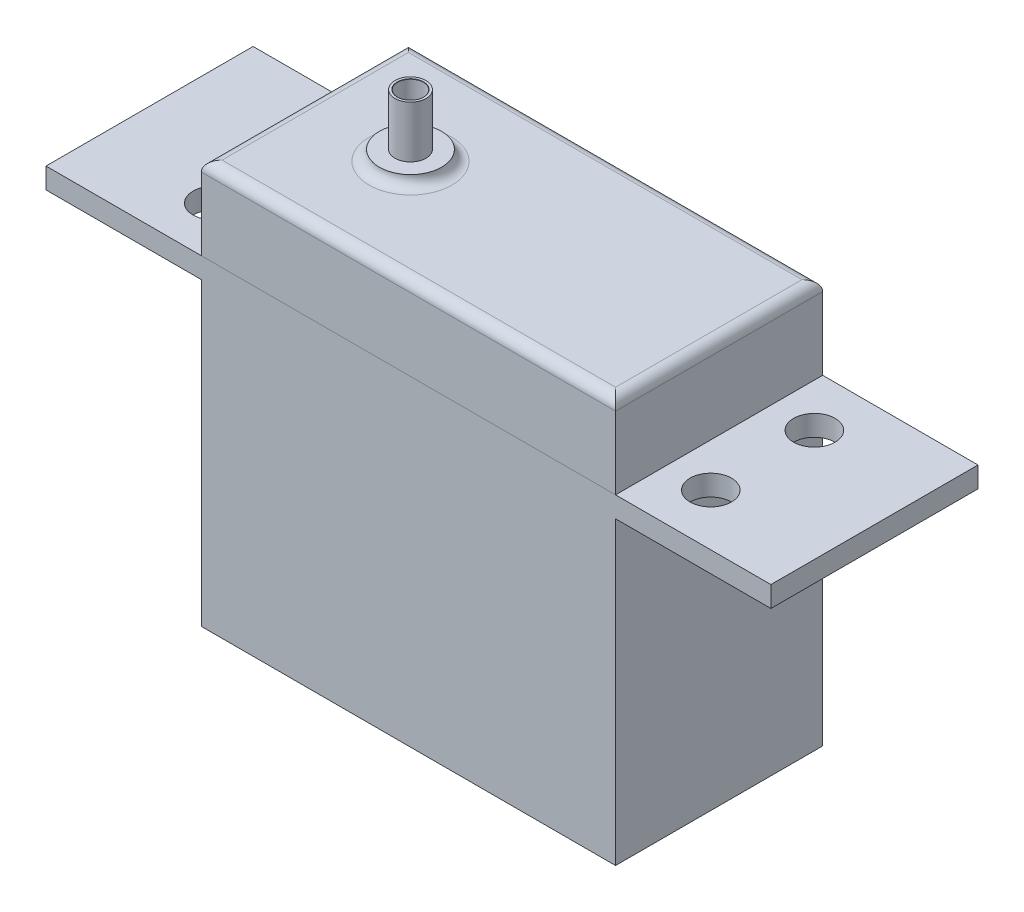
ISO-10303-21;
HEADER;
FILE_DESCRIPTION(('STEP AP214'),'2;1');
FILE_NAME('part.step','',(''),(''),'','','');
FILE_SCHEMA(('AUTOMOTIVE_DESIGN { 1 0 10303 214 1 1 1 1 }'));
ENDSEC;
DATA;
#1=APPLICATION_CONTEXT('core data for automotive mechanical design processes');
#2=APPLICATION_PROTOCOL_DEFINITION('international standard','automotive_design',2000,#1);
#3=PRODUCT_CONTEXT('',#1,'mechanical');
#4=PRODUCT('Part','Part','',(#3));
#5=PRODUCT_RELATED_PRODUCT_CATEGORY('part','',(#4));
#6=PRODUCT_DEFINITION_FORMATION('','',#4);
#7=PRODUCT_DEFINITION_CONTEXT('part definition',#1,'design');
#8=PRODUCT_DEFINITION('design','',#6,#7);
#9=PRODUCT_DEFINITION_SHAPE('','',#8);
#10=(LENGTH_UNIT() NAMED_UNIT(*) SI_UNIT(.MILLI.,.METRE.));
#11=(NAMED_UNIT(*) PLANE_ANGLE_UNIT() SI_UNIT($,.RADIAN.));
#12=(NAMED_UNIT(*) SI_UNIT($,.STERADIAN.) SOLID_ANGLE_UNIT());
#13=UNCERTAINTY_MEASURE_WITH_UNIT(LENGTH_MEASURE(1.E-05),#10,'distance_accuracy_value','');
#14=(GEOMETRIC_REPRESENTATION_CONTEXT(3) GLOBAL_UNCERTAINTY_ASSIGNED_CONTEXT((#13)) GLOBAL_UNIT_ASSIGNED_CONTEXT((#10,
#11,#12)) REPRESENTATION_CONTEXT('',''));
#15=CARTESIAN_POINT('',(0.,0.,0.));
#16=DIRECTION('',(0.,0.,1.));
#17=DIRECTION('',(1.,0.,0.));
#18=AXIS2_PLACEMENT_3D('',#15,#16,#17);
#19=CARTESIAN_POINT('',(0.,0.,0.));
#20=DIRECTION('',(0.,0.,1.));
#21=DIRECTION('',(1.,0.,0.));
#22=AXIS2_PLACEMENT_3D('',#19,#20,#21);
#23=PLANE('',#22);
#24=DIRECTION('',(-1.,0.,0.));
#25=VECTOR('',#24,1.);
#26=CARTESIAN_POINT('',(0.,11.5,0.));
#27=LINE('',#26,#25);
#28=CARTESIAN_POINT('',(20.,11.5,0.));
#29=VERTEX_POINT('',#28);
#30=CARTESIAN_POINT('',(-20.,11.5,0.));
#31=VERTEX_POINT('',#30);
#32=EDGE_CURVE('E175',#29,#31,#27,.T.);
#33=ORIENTED_EDGE('',*,*,#32,.F.);
#34=DIRECTION('',(-1.,0.,0.));
#35=VECTOR('',#34,1.);
#36=CARTESIAN_POINT('',(35.,11.5,0.));
#37=LINE('',#36,#35);
#38=CARTESIAN_POINT('',(35.,11.5,0.));
#39=VERTEX_POINT('',#38);
#40=EDGE_CURVE('E222',#39,#29,#37,.T.);
#41=ORIENTED_EDGE('',*,*,#40,.F.);
#42=DIRECTION('',(0.,-1.,0.));
#43=VECTOR('',#42,1.);
#44=CARTESIAN_POINT('',(35.,11.5,0.));
#45=LINE('',#44,#43);
#46=CARTESIAN_POINT('',(35.,9.49999999999999,0.));
#47=VERTEX_POINT('',#46);
#48=EDGE_CURVE('E209',#39,#47,#45,.T.);
#49=ORIENTED_EDGE('',*,*,#48,.T.);
#50=DIRECTION('',(-1.,0.,0.));
#51=VECTOR('',#50,1.);
#52=CARTESIAN_POINT('',(35.,9.49999999999999,0.));
#53=LINE('',#52,#51);
#54=CARTESIAN_POINT('',(20.,9.5,0.));
#55=VERTEX_POINT('',#54);
#56=EDGE_CURVE('E225',#47,#55,#53,.T.);
#57=ORIENTED_EDGE('',*,*,#56,.T.);
#58=DIRECTION('',(0.,1.,0.));
#59=VECTOR('',#58,1.);
#60=CARTESIAN_POINT('',(20.,-19.5,0.));
#61=LINE('',#60,#59);
#62=CARTESIAN_POINT('',(20.,-19.5,0.));
#63=VERTEX_POINT('',#62);
#64=EDGE_CURVE('E272',#63,#55,#61,.T.);
#65=ORIENTED_EDGE('',*,*,#64,.F.);
#66=DIRECTION('',(-1.,0.,0.));
#67=VECTOR('',#66,1.);
#68=CARTESIAN_POINT('',(20.,-19.5,0.));
#69=LINE('',#68,#67);
#70=CARTESIAN_POINT('',(-20.,-19.5,0.));
#71=VERTEX_POINT('',#70);
#72=EDGE_CURVE('E278',#63,#71,#69,.T.);
#73=ORIENTED_EDGE('',*,*,#72,.T.);
#74=DIRECTION('',(0.,1.,0.));
#75=VECTOR('',#74,1.);
#76=CARTESIAN_POINT('',(-20.,-19.5,0.));
#77=LINE('',#76,#75);
#78=CARTESIAN_POINT('',(-20.,9.5,0.));
#79=VERTEX_POINT('',#78);
#80=EDGE_CURVE('E275',#71,#79,#77,.T.);
#81=ORIENTED_EDGE('',*,*,#80,.T.);
#82=DIRECTION('',(1.,0.,0.));
#83=VECTOR('',#82,1.);
#84=CARTESIAN_POINT('',(-35.,9.5,0.));
#85=LINE('',#84,#83);
#86=CARTESIAN_POINT('',(-35.,9.5,0.));
#87=VERTEX_POINT('',#86);
#88=EDGE_CURVE('E257',#87,#79,#85,.T.);
#89=ORIENTED_EDGE('',*,*,#88,.F.);
#90=DIRECTION('',(0.,-1.,0.));
#91=VECTOR('',#90,1.);
#92=CARTESIAN_POINT('',(-35.,11.5,0.));
#93=LINE('',#92,#91);
#94=CARTESIAN_POINT('',(-35.,11.5,0.));
#95=VERTEX_POINT('',#94);
#96=EDGE_CURVE('E232',#95,#87,#93,.T.);
#97=ORIENTED_EDGE('',*,*,#96,.F.);
#98=DIRECTION('',(1.,0.,0.));
#99=VECTOR('',#98,1.);
#100=CARTESIAN_POINT('',(-35.,11.5,0.));
#101=LINE('',#100,#99);
#102=EDGE_CURVE('E244',#95,#31,#101,.T.);
#103=ORIENTED_EDGE('',*,*,#102,.T.);
#104=EDGE_LOOP('',(#33,#41,#49,#57,#65,#73,#81,#89,#97,#103));
#105=FACE_BOUND('',#104,.T.);
#106=ADVANCED_FACE('F45',(#105),#23,.F.);
#107=CARTESIAN_POINT('',(0.,0.,20.));
#108=DIRECTION('',(0.,0.,1.));
#109=DIRECTION('',(1.,0.,0.));
#110=AXIS2_PLACEMENT_3D('',#107,#108,#109);
#111=PLANE('',#110);
#112=DIRECTION('',(-1.,0.,0.));
#113=VECTOR('',#112,1.);
#114=CARTESIAN_POINT('',(35.,11.5,20.));
#115=LINE('',#114,#113);
#116=CARTESIAN_POINT('',(35.,11.5,20.));
#117=VERTEX_POINT('',#116);
#118=CARTESIAN_POINT('',(20.,11.5,20.));
#119=VERTEX_POINT('',#118);
#120=EDGE_CURVE('E215',#117,#119,#115,.T.);
#121=ORIENTED_EDGE('',*,*,#120,.T.);
#122=DIRECTION('',(-1.,0.,0.));
#123=VECTOR('',#122,1.);
#124=CARTESIAN_POINT('',(0.,11.5,20.));
#125=LINE('',#124,#123);
#126=CARTESIAN_POINT('',(-20.,11.5,20.));
#127=VERTEX_POINT('',#126);
#128=EDGE_CURVE('E284',#119,#127,#125,.T.);
#129=ORIENTED_EDGE('',*,*,#128,.T.);
#130=DIRECTION('',(1.,0.,0.));
#131=VECTOR('',#130,1.);
#132=CARTESIAN_POINT('',(-35.,11.5,20.));
#133=LINE('',#132,#131);
#134=CARTESIAN_POINT('',(-35.,11.5,20.));
#135=VERTEX_POINT('',#134);
#136=EDGE_CURVE('E251',#135,#127,#133,.T.);
#137=ORIENTED_EDGE('',*,*,#136,.F.);
#138=DIRECTION('',(0.,-1.,0.));
#139=VECTOR('',#138,1.);
#140=CARTESIAN_POINT('',(-35.,11.5,20.));
#141=LINE('',#140,#139);
#142=CARTESIAN_POINT('',(-35.,9.5,20.));
#143=VERTEX_POINT('',#142);
#144=EDGE_CURVE('E238',#135,#143,#141,.T.);
#145=ORIENTED_EDGE('',*,*,#144,.T.);
#146=DIRECTION('',(1.,0.,0.));
#147=VECTOR('',#146,1.);
#148=CARTESIAN_POINT('',(-35.,9.5,20.));
#149=LINE('',#148,#147);
#150=CARTESIAN_POINT('',(-20.,9.5,20.));
#151=VERTEX_POINT('',#150);
#152=EDGE_CURVE('E254',#143,#151,#149,.T.);
#153=ORIENTED_EDGE('',*,*,#152,.T.);
#154=DIRECTION('',(0.,1.,0.));
#155=VECTOR('',#154,1.);
#156=CARTESIAN_POINT('',(-20.,-19.5,20.));
#157=LINE('',#156,#155);
#158=CARTESIAN_POINT('',(-20.,-19.5,20.));
#159=VERTEX_POINT('',#158);
#160=EDGE_CURVE('E266',#159,#151,#157,.T.);
#161=ORIENTED_EDGE('',*,*,#160,.F.);
#162=DIRECTION('',(-1.,0.,0.));
#163=VECTOR('',#162,1.);
#164=CARTESIAN_POINT('',(20.,-19.5,20.));
#165=LINE('',#164,#163);
#166=CARTESIAN_POINT('',(20.,-19.5,20.));
#167=VERTEX_POINT('',#166);
#168=EDGE_CURVE('E268',#167,#159,#165,.T.);
#169=ORIENTED_EDGE('',*,*,#168,.F.);
#170=DIRECTION('',(0.,1.,0.));
#171=VECTOR('',#170,1.);
#172=CARTESIAN_POINT('',(20.,-19.5,20.));
#173=LINE('',#172,#171);
#174=CARTESIAN_POINT('',(20.,9.5,20.));
#175=VERTEX_POINT('',#174);
#176=EDGE_CURVE('E261',#167,#175,#173,.T.);
#177=ORIENTED_EDGE('',*,*,#176,.T.);
#178=DIRECTION('',(-1.,0.,0.));
#179=VECTOR('',#178,1.);
#180=CARTESIAN_POINT('',(35.,9.5,20.));
#181=LINE('',#180,#179);
#182=CARTESIAN_POINT('',(35.,9.5,20.));
#183=VERTEX_POINT('',#182);
#184=EDGE_CURVE('E228',#183,#175,#181,.T.);
#185=ORIENTED_EDGE('',*,*,#184,.F.);
#186=DIRECTION('',(0.,-1.,0.));
#187=VECTOR('',#186,1.);
#188=CARTESIAN_POINT('',(35.,11.5,20.));
#189=LINE('',#188,#187);
#190=EDGE_CURVE('E203',#117,#183,#189,.T.);
#191=ORIENTED_EDGE('',*,*,#190,.F.);
#192=EDGE_LOOP('',(#121,#129,#137,#145,#153,#161,#169,#177,#185,#191));
#193=FACE_BOUND('',#192,.T.);
#194=ADVANCED_FACE('F352',(#193),#111,.T.);
#195=CARTESIAN_POINT('',(-35.,9.5,0.));
#196=DIRECTION('',(0.,1.,0.));
#197=DIRECTION('',(0.,0.,1.));
#198=AXIS2_PLACEMENT_3D('',#195,#196,#197);
#199=PLANE('',#198);
#200=CARTESIAN_POINT('',(-23.8042441705195,9.5,5.));
#201=DIRECTION('',(0.,1.,0.));
#202=DIRECTION('',(0.,0.,1.));
#203=AXIS2_PLACEMENT_3D('',#200,#201,#202);
#204=CIRCLE('',#203,2.);
#205=CARTESIAN_POINT('',(-23.8042441705195,9.5,7.));
#206=VERTEX_POINT('',#205);
#207=EDGE_CURVE('E196',#206,#206,#204,.T.);
#208=ORIENTED_EDGE('',*,*,#207,.T.);
#209=EDGE_LOOP('',(#208));
#210=FACE_BOUND('',#209,.T.);
#211=DIRECTION('',(0.,0.,1.));
#212=VECTOR('',#211,1.);
#213=CARTESIAN_POINT('',(-20.,9.5,0.));
#214=LINE('',#213,#212);
#215=EDGE_CURVE('E231',#79,#151,#214,.T.);
#216=ORIENTED_EDGE('',*,*,#215,.T.);
#217=ORIENTED_EDGE('',*,*,#152,.F.);
#218=DIRECTION('',(0.,0.,1.));
#219=VECTOR('',#218,1.);
#220=CARTESIAN_POINT('',(-35.,9.5,0.));
#221=LINE('',#220,#219);
#222=EDGE_CURVE('E235',#87,#143,#221,.T.);
#223=ORIENTED_EDGE('',*,*,#222,.F.);
#224=ORIENTED_EDGE('',*,*,#88,.T.);
#225=EDGE_LOOP('',(#216,#217,#223,#224));
#226=FACE_BOUND('',#225,.T.);
#227=CARTESIAN_POINT('',(-23.8042441705195,9.5,15.));
#228=DIRECTION('',(0.,1.,0.));
#229=DIRECTION('',(0.,0.,1.));
#230=AXIS2_PLACEMENT_3D('',#227,#228,#229);
#231=CIRCLE('',#230,2.);
#232=CARTESIAN_POINT('',(-23.8042441705195,9.5,17.));
#233=VERTEX_POINT('',#232);
#234=EDGE_CURVE('E199',#233,#233,#231,.F.);
#235=ORIENTED_EDGE('',*,*,#234,.F.);
#236=EDGE_LOOP('',(#235));
#237=FACE_BOUND('',#236,.T.);
#238=ADVANCED_FACE('F359',(#210,#226,#237),#199,.F.);
#239=CARTESIAN_POINT('',(-35.,11.5,0.));
#240=DIRECTION('',(0.,1.,0.));
#241=DIRECTION('',(0.,0.,1.));
#242=AXIS2_PLACEMENT_3D('',#239,#240,#241);
#243=PLANE('',#242);
#244=DIRECTION('',(0.,0.,1.));
#245=VECTOR('',#244,1.);
#246=CARTESIAN_POINT('',(-20.,11.5,0.));
#247=LINE('',#246,#245);
#248=EDGE_CURVE('E236',#31,#127,#247,.T.);
#249=ORIENTED_EDGE('',*,*,#248,.F.);
#250=ORIENTED_EDGE('',*,*,#102,.F.);
#251=DIRECTION('',(0.,0.,1.));
#252=VECTOR('',#251,1.);
#253=CARTESIAN_POINT('',(-35.,11.5,0.));
#254=LINE('',#253,#252);
#255=EDGE_CURVE('E241',#95,#135,#254,.T.);
#256=ORIENTED_EDGE('',*,*,#255,.T.);
#257=ORIENTED_EDGE('',*,*,#136,.T.);
#258=EDGE_LOOP('',(#249,#250,#256,#257));
#259=FACE_BOUND('',#258,.T.);
#260=CARTESIAN_POINT('',(-23.8042441705195,11.5,5.));
#261=DIRECTION('',(0.,1.,0.));
#262=DIRECTION('',(0.,0.,1.));
#263=AXIS2_PLACEMENT_3D('',#260,#261,#262);
#264=CIRCLE('',#263,2.);
#265=CARTESIAN_POINT('',(-23.8042441705195,11.5,7.));
#266=VERTEX_POINT('',#265);
#267=EDGE_CURVE('E185',#266,#266,#264,.T.);
#268=ORIENTED_EDGE('',*,*,#267,.F.);
#269=EDGE_LOOP('',(#268));
#270=FACE_BOUND('',#269,.T.);
#271=CARTESIAN_POINT('',(-23.8042441705195,11.5,15.));
#272=DIRECTION('',(0.,-1.,0.));
#273=DIRECTION('',(0.,0.,-1.));
#274=AXIS2_PLACEMENT_3D('',#271,#272,#273);
#275=CIRCLE('',#274,2.);
#276=CARTESIAN_POINT('',(-23.8042441705195,11.5,13.));
#277=VERTEX_POINT('',#276);
#278=EDGE_CURVE('E182',#277,#277,#275,.T.);
#279=ORIENTED_EDGE('',*,*,#278,.T.);
#280=EDGE_LOOP('',(#279));
#281=FACE_BOUND('',#280,.T.);
#282=ADVANCED_FACE('F393',(#259,#270,#281),#243,.T.);
#283=CARTESIAN_POINT('',(35.,9.5,20.));
#284=DIRECTION('',(0.,1.,0.));
#285=DIRECTION('',(-1.,0.,0.));
#286=AXIS2_PLACEMENT_3D('',#283,#284,#285);
#287=PLANE('',#286);
#288=DIRECTION('',(0.,0.,-1.));
#289=VECTOR('',#288,1.);
#290=CARTESIAN_POINT('',(20.,9.5,20.));
#291=LINE('',#290,#289);
#292=EDGE_CURVE('E202',#175,#55,#291,.T.);
#293=ORIENTED_EDGE('',*,*,#292,.T.);
#294=ORIENTED_EDGE('',*,*,#56,.F.);
#295=DIRECTION('',(0.,0.,-1.));
#296=VECTOR('',#295,1.);
#297=CARTESIAN_POINT('',(35.,9.5,20.));
#298=LINE('',#297,#296);
#299=EDGE_CURVE('E206',#183,#47,#298,.T.);
#300=ORIENTED_EDGE('',*,*,#299,.F.);
#301=ORIENTED_EDGE('',*,*,#184,.T.);
#302=EDGE_LOOP('',(#293,#294,#300,#301));
#303=FACE_BOUND('',#302,.T.);
#304=CARTESIAN_POINT('',(24.1957558294805,9.5,15.));
#305=DIRECTION('',(0.,1.,0.));
#306=DIRECTION('',(-1.,0.,0.));
#307=AXIS2_PLACEMENT_3D('',#304,#305,#306);
#308=CIRCLE('',#307,2.);
#309=CARTESIAN_POINT('',(22.1957558294805,9.5,15.));
#310=VERTEX_POINT('',#309);
#311=EDGE_CURVE('E190',#310,#310,#308,.F.);
#312=ORIENTED_EDGE('',*,*,#311,.F.);
#313=EDGE_LOOP('',(#312));
#314=FACE_BOUND('',#313,.T.);
#315=CARTESIAN_POINT('',(24.1957558294805,9.49999999999999,5.));
#316=DIRECTION('',(0.,1.,0.));
#317=DIRECTION('',(-1.,0.,0.));
#318=AXIS2_PLACEMENT_3D('',#315,#316,#317);
#319=CIRCLE('',#318,2.);
#320=CARTESIAN_POINT('',(22.1957558294805,9.49999999999999,5.));
#321=VERTEX_POINT('',#320);
#322=EDGE_CURVE('E193',#321,#321,#319,.T.);
#323=ORIENTED_EDGE('',*,*,#322,.T.);
#324=EDGE_LOOP('',(#323));
#325=FACE_BOUND('',#324,.T.);
#326=ADVANCED_FACE('F413',(#303,#314,#325),#287,.F.);
#327=CARTESIAN_POINT('',(35.,11.5,20.));
#328=DIRECTION('',(0.,1.,0.));
#329=DIRECTION('',(-1.,0.,0.));
#330=AXIS2_PLACEMENT_3D('',#327,#328,#329);
#331=PLANE('',#330);
#332=CARTESIAN_POINT('',(24.1957558294805,11.5,15.));
#333=DIRECTION('',(0.,-1.,0.));
#334=DIRECTION('',(0.,0.,-1.));
#335=AXIS2_PLACEMENT_3D('',#332,#333,#334);
#336=CIRCLE('',#335,2.);
#337=CARTESIAN_POINT('',(24.1957558294805,11.5,13.));
#338=VERTEX_POINT('',#337);
#339=EDGE_CURVE('E178',#338,#338,#336,.T.);
#340=ORIENTED_EDGE('',*,*,#339,.T.);
#341=EDGE_LOOP('',(#340));
#342=FACE_BOUND('',#341,.T.);
#343=DIRECTION('',(0.,0.,-1.));
#344=VECTOR('',#343,1.);
#345=CARTESIAN_POINT('',(20.,11.5,20.));
#346=LINE('',#345,#344);
#347=EDGE_CURVE('E207',#119,#29,#346,.T.);
#348=ORIENTED_EDGE('',*,*,#347,.F.);
#349=ORIENTED_EDGE('',*,*,#120,.F.);
#350=DIRECTION('',(0.,0.,-1.));
#351=VECTOR('',#350,1.);
#352=CARTESIAN_POINT('',(35.,11.5,20.));
#353=LINE('',#352,#351);
#354=EDGE_CURVE('E212',#117,#39,#353,.T.);
#355=ORIENTED_EDGE('',*,*,#354,.T.);
#356=ORIENTED_EDGE('',*,*,#40,.T.);
#357=EDGE_LOOP('',(#348,#349,#355,#356));
#358=FACE_BOUND('',#357,.T.);
#359=CARTESIAN_POINT('',(24.1957558294805,11.5,5.));
#360=DIRECTION('',(0.,1.,0.));
#361=DIRECTION('',(0.,0.,1.));
#362=AXIS2_PLACEMENT_3D('',#359,#360,#361);
#363=CIRCLE('',#362,2.);
#364=CARTESIAN_POINT('',(24.1957558294805,11.5,7.));
#365=VERTEX_POINT('',#364);
#366=EDGE_CURVE('E181',#365,#365,#363,.T.);
#367=ORIENTED_EDGE('',*,*,#366,.F.);
#368=EDGE_LOOP('',(#367));
#369=FACE_BOUND('',#368,.T.);
#370=ADVANCED_FACE('F420',(#342,#358,#369),#331,.T.);
#371=CARTESIAN_POINT('',(20.,-19.5,20.));
#372=DIRECTION('',(-1.,0.,0.));
#373=DIRECTION('',(0.,-1.,0.));
#374=AXIS2_PLACEMENT_3D('',#371,#372,#373);
#375=PLANE('',#374);
#376=ORIENTED_EDGE('',*,*,#292,.F.);
#377=ORIENTED_EDGE('',*,*,#176,.F.);
#378=DIRECTION('',(0.,0.,-1.));
#379=VECTOR('',#378,1.);
#380=CARTESIAN_POINT('',(20.,-19.5,20.));
#381=LINE('',#380,#379);
#382=EDGE_CURVE('E271',#167,#63,#381,.T.);
#383=ORIENTED_EDGE('',*,*,#382,.T.);
#384=ORIENTED_EDGE('',*,*,#64,.T.);
#385=EDGE_LOOP('',(#376,#377,#383,#384));
#386=FACE_BOUND('',#385,.T.);
#387=ADVANCED_FACE('F423',(#386),#375,.F.);
#388=CARTESIAN_POINT('',(-20.,-19.5,20.));
#389=DIRECTION('',(-1.,0.,0.));
#390=DIRECTION('',(0.,0.,1.));
#391=AXIS2_PLACEMENT_3D('',#388,#389,#390);
#392=PLANE('',#391);
#393=CARTESIAN_POINT('',(-20.,18.5,20.));
#394=VERTEX_POINT('',#393);
#395=EDGE_CURVE('E264',#127,#394,#157,.T.);
#396=ORIENTED_EDGE('',*,*,#395,.T.);
#397=DIRECTION('',(0.,0.,-1.));
#398=VECTOR('',#397,1.);
#399=CARTESIAN_POINT('',(-20.,18.5,0.));
#400=LINE('',#399,#398);
#401=CARTESIAN_POINT('',(-20.,18.5,0.));
#402=VERTEX_POINT('',#401);
#403=EDGE_CURVE('E54',#394,#402,#400,.T.);
#404=ORIENTED_EDGE('',*,*,#403,.T.);
#405=EDGE_CURVE('E274',#31,#402,#77,.T.);
#406=ORIENTED_EDGE('',*,*,#405,.F.);
#407=ORIENTED_EDGE('',*,*,#248,.T.);
#408=EDGE_LOOP('',(#396,#404,#406,#407));
#409=FACE_BOUND('',#408,.T.);
#410=ADVANCED_FACE('F391',(#409),#392,.T.);
#411=CARTESIAN_POINT('',(20.,18.5,0.));
#412=VERTEX_POINT('',#411);
#413=EDGE_CURVE('E260',#29,#412,#61,.T.);
#414=ORIENTED_EDGE('',*,*,#413,.T.);
#415=DIRECTION('',(0.,0.,-1.));
#416=VECTOR('',#415,1.);
#417=CARTESIAN_POINT('',(20.,18.5,20.));
#418=LINE('',#417,#416);
#419=CARTESIAN_POINT('',(20.,18.5,20.));
#420=VERTEX_POINT('',#419);
#421=EDGE_CURVE('E300',#412,#420,#418,.F.);
#422=ORIENTED_EDGE('',*,*,#421,.T.);
#423=EDGE_CURVE('E265',#119,#420,#173,.T.);
#424=ORIENTED_EDGE('',*,*,#423,.F.);
#425=ORIENTED_EDGE('',*,*,#347,.T.);
#426=EDGE_LOOP('',(#414,#422,#424,#425));
#427=FACE_BOUND('',#426,.T.);
#428=ADVANCED_FACE('F386',(#427),#375,.F.);
#429=CARTESIAN_POINT('',(20.,19.5,20.));
#430=DIRECTION('',(0.,-1.,0.));
#431=DIRECTION('',(0.,0.,-1.));
#432=AXIS2_PLACEMENT_3D('',#429,#430,#431);
#433=PLANE('',#432);
#434=DIRECTION('',(-1.,0.,0.));
#435=VECTOR('',#434,1.);
#436=CARTESIAN_POINT('',(20.,19.5,19.));
#437=LINE('',#436,#435);
#438=CARTESIAN_POINT('',(-19.,19.5,19.));
#439=VERTEX_POINT('',#438);
#440=CARTESIAN_POINT('',(19.,19.5,19.));
#441=VERTEX_POINT('',#440);
#442=EDGE_CURVE('E295',#439,#441,#437,.F.);
#443=ORIENTED_EDGE('',*,*,#442,.T.);
#444=DIRECTION('',(0.,0.,-1.));
#445=VECTOR('',#444,1.);
#446=CARTESIAN_POINT('',(19.,19.5,20.));
#447=LINE('',#446,#445);
#448=CARTESIAN_POINT('',(19.,19.5,1.));
#449=VERTEX_POINT('',#448);
#450=EDGE_CURVE('E297',#441,#449,#447,.T.);
#451=ORIENTED_EDGE('',*,*,#450,.T.);
#452=DIRECTION('',(-1.,0.,0.));
#453=VECTOR('',#452,1.);
#454=CARTESIAN_POINT('',(20.,19.5,1.));
#455=LINE('',#454,#453);
#456=CARTESIAN_POINT('',(-19.,19.5,1.));
#457=VERTEX_POINT('',#456);
#458=EDGE_CURVE('E291',#449,#457,#455,.T.);
#459=ORIENTED_EDGE('',*,*,#458,.T.);
#460=DIRECTION('',(0.,0.,-1.));
#461=VECTOR('',#460,1.);
#462=CARTESIAN_POINT('',(-19.,19.5,20.));
#463=LINE('',#462,#461);
#464=EDGE_CURVE('E293',#457,#439,#463,.F.);
#465=ORIENTED_EDGE('',*,*,#464,.T.);
#466=EDGE_LOOP('',(#443,#451,#459,#465));
#467=FACE_BOUND('',#466,.T.);
#468=CARTESIAN_POINT('',(-9.80424417051946,19.5,10.));
#469=DIRECTION('',(0.,-1.,0.));
#470=DIRECTION('',(0.,0.,-1.));
#471=AXIS2_PLACEMENT_3D('',#468,#469,#470);
#472=CIRCLE('',#471,4.);
#473=CARTESIAN_POINT('',(-9.80424417051946,19.5,6.));
#474=VERTEX_POINT('',#473);
#475=EDGE_CURVE('E174',#474,#474,#472,.T.);
#476=ORIENTED_EDGE('',*,*,#475,.T.);
#477=EDGE_LOOP('',(#476));
#478=FACE_BOUND('',#477,.T.);
#479=ADVANCED_FACE('F488',(#467,#478),#433,.F.);
#480=ORIENTED_EDGE('',*,*,#215,.F.);
#481=ORIENTED_EDGE('',*,*,#80,.F.);
#482=DIRECTION('',(0.,0.,-1.));
#483=VECTOR('',#482,1.);
#484=CARTESIAN_POINT('',(-20.,-19.5,20.));
#485=LINE('',#484,#483);
#486=EDGE_CURVE('E282',#159,#71,#485,.T.);
#487=ORIENTED_EDGE('',*,*,#486,.F.);
#488=ORIENTED_EDGE('',*,*,#160,.T.);
#489=EDGE_LOOP('',(#480,#481,#487,#488));
#490=FACE_BOUND('',#489,.T.);
#491=ADVANCED_FACE('F405',(#490),#392,.T.);
#492=CARTESIAN_POINT('',(20.,-19.5,20.));
#493=DIRECTION('',(0.,-1.,0.));
#494=DIRECTION('',(1.,0.,0.));
#495=AXIS2_PLACEMENT_3D('',#492,#493,#494);
#496=PLANE('',#495);
#497=ORIENTED_EDGE('',*,*,#72,.F.);
#498=ORIENTED_EDGE('',*,*,#382,.F.);
#499=ORIENTED_EDGE('',*,*,#168,.T.);
#500=ORIENTED_EDGE('',*,*,#486,.T.);
#501=EDGE_LOOP('',(#497,#498,#499,#500));
#502=FACE_BOUND('',#501,.T.);
#503=ADVANCED_FACE('F374',(#502),#496,.T.);
#504=ORIENTED_EDGE('',*,*,#423,.T.);
#505=DIRECTION('',(-1.,0.,0.));
#506=VECTOR('',#505,1.);
#507=CARTESIAN_POINT('',(-20.,18.5,20.));
#508=LINE('',#507,#506);
#509=EDGE_CURVE('E69',#420,#394,#508,.T.);
#510=ORIENTED_EDGE('',*,*,#509,.T.);
#511=ORIENTED_EDGE('',*,*,#395,.F.);
#512=ORIENTED_EDGE('',*,*,#128,.F.);
#513=EDGE_LOOP('',(#504,#510,#511,#512));
#514=FACE_BOUND('',#513,.T.);
#515=ADVANCED_FACE('F362',(#514),#111,.T.);
#516=ORIENTED_EDGE('',*,*,#405,.T.);
#517=DIRECTION('',(-1.,0.,0.));
#518=VECTOR('',#517,1.);
#519=CARTESIAN_POINT('',(0.,18.5,0.));
#520=LINE('',#519,#518);
#521=EDGE_CURVE('E11',#402,#412,#520,.F.);
#522=ORIENTED_EDGE('',*,*,#521,.T.);
#523=ORIENTED_EDGE('',*,*,#413,.F.);
#524=ORIENTED_EDGE('',*,*,#32,.T.);
#525=EDGE_LOOP('',(#516,#522,#523,#524));
#526=FACE_BOUND('',#525,.T.);
#527=ADVANCED_FACE('F355',(#526),#23,.F.);
#528=CARTESIAN_POINT('',(-35.,0.,0.));
#529=DIRECTION('',(-1.,0.,0.));
#530=DIRECTION('',(0.,0.,1.));
#531=AXIS2_PLACEMENT_3D('',#528,#529,#530);
#532=PLANE('',#531);
#533=ORIENTED_EDGE('',*,*,#96,.T.);
#534=ORIENTED_EDGE('',*,*,#222,.T.);
#535=ORIENTED_EDGE('',*,*,#144,.F.);
#536=ORIENTED_EDGE('',*,*,#255,.F.);
#537=EDGE_LOOP('',(#533,#534,#535,#536));
#538=FACE_BOUND('',#537,.T.);
#539=ADVANCED_FACE('F365',(#538),#532,.T.);
#540=CARTESIAN_POINT('',(35.,0.,0.));
#541=DIRECTION('',(1.,0.,0.));
#542=DIRECTION('',(0.,0.,-1.));
#543=AXIS2_PLACEMENT_3D('',#540,#541,#542);
#544=PLANE('',#543);
#545=ORIENTED_EDGE('',*,*,#190,.T.);
#546=ORIENTED_EDGE('',*,*,#299,.T.);
#547=ORIENTED_EDGE('',*,*,#48,.F.);
#548=ORIENTED_EDGE('',*,*,#354,.F.);
#549=EDGE_LOOP('',(#545,#546,#547,#548));
#550=FACE_BOUND('',#549,.T.);
#551=ADVANCED_FACE('F371',(#550),#544,.T.);
#552=CARTESIAN_POINT('',(24.1957558294805,5.5,15.));
#553=DIRECTION('',(0.,1.,0.));
#554=DIRECTION('',(0.,0.,1.));
#555=AXIS2_PLACEMENT_3D('',#552,#553,#554);
#556=CYLINDRICAL_SURFACE('',#555,2.);
#557=ORIENTED_EDGE('',*,*,#339,.F.);
#558=EDGE_LOOP('',(#557));
#559=FACE_BOUND('',#558,.T.);
#560=ORIENTED_EDGE('',*,*,#311,.T.);
#561=EDGE_LOOP('',(#560));
#562=FACE_BOUND('',#561,.T.);
#563=ADVANCED_FACE('F432',(#559,#562),#556,.F.);
#564=CARTESIAN_POINT('',(24.1957558294805,5.5,5.));
#565=DIRECTION('',(0.,1.,0.));
#566=DIRECTION('',(0.,0.,1.));
#567=AXIS2_PLACEMENT_3D('',#564,#565,#566);
#568=CYLINDRICAL_SURFACE('',#567,2.);
#569=ORIENTED_EDGE('',*,*,#366,.T.);
#570=EDGE_LOOP('',(#569));
#571=FACE_BOUND('',#570,.T.);
#572=ORIENTED_EDGE('',*,*,#322,.F.);
#573=EDGE_LOOP('',(#572));
#574=FACE_BOUND('',#573,.T.);
#575=ADVANCED_FACE('F428',(#571,#574),#568,.F.);
#576=CARTESIAN_POINT('',(-23.8042441705195,5.5,5.));
#577=DIRECTION('',(0.,1.,0.));
#578=DIRECTION('',(0.,0.,1.));
#579=AXIS2_PLACEMENT_3D('',#576,#577,#578);
#580=CYLINDRICAL_SURFACE('',#579,2.);
#581=ORIENTED_EDGE('',*,*,#267,.T.);
#582=EDGE_LOOP('',(#581));
#583=FACE_BOUND('',#582,.T.);
#584=ORIENTED_EDGE('',*,*,#207,.F.);
#585=EDGE_LOOP('',(#584));
#586=FACE_BOUND('',#585,.T.);
#587=ADVANCED_FACE('F431',(#583,#586),#580,.F.);
#588=CARTESIAN_POINT('',(-23.8042441705195,5.5,15.));
#589=DIRECTION('',(0.,1.,0.));
#590=DIRECTION('',(0.,0.,1.));
#591=AXIS2_PLACEMENT_3D('',#588,#589,#590);
#592=CYLINDRICAL_SURFACE('',#591,2.);
#593=ORIENTED_EDGE('',*,*,#278,.F.);
#594=EDGE_LOOP('',(#593));
#595=FACE_BOUND('',#594,.T.);
#596=ORIENTED_EDGE('',*,*,#234,.T.);
#597=EDGE_LOOP('',(#596));
#598=FACE_BOUND('',#597,.T.);
#599=ADVANCED_FACE('F337',(#595,#598),#592,.F.);
#600=CARTESIAN_POINT('',(-9.80424417051946,20.5,10.));
#601=DIRECTION('',(0.,1.,0.));
#602=DIRECTION('',(0.,0.,1.));
#603=AXIS2_PLACEMENT_3D('',#600,#601,#602);
#604=PLANE('',#603);
#605=CARTESIAN_POINT('',(-9.80424417051946,20.5,10.));
#606=DIRECTION('',(0.,1.,0.));
#607=DIRECTION('',(0.,0.,1.));
#608=AXIS2_PLACEMENT_3D('',#605,#606,#607);
#609=CIRCLE('',#608,1.5);
#610=CARTESIAN_POINT('',(-9.80424417051946,20.5,11.5));
#611=VERTEX_POINT('',#610);
#612=EDGE_CURVE('E171',#611,#611,#609,.T.);
#613=ORIENTED_EDGE('',*,*,#612,.F.);
#614=EDGE_LOOP('',(#613));
#615=FACE_BOUND('',#614,.T.);
#616=CARTESIAN_POINT('',(-9.80424417051946,20.5,10.));
#617=DIRECTION('',(0.,1.,0.));
#618=DIRECTION('',(0.,0.,1.));
#619=AXIS2_PLACEMENT_3D('',#616,#617,#618);
#620=CIRCLE('',#619,3.);
#621=CARTESIAN_POINT('',(-9.80424417051946,20.5,13.));
#622=VERTEX_POINT('',#621);
#623=EDGE_CURVE('E164',#622,#622,#620,.T.);
#624=ORIENTED_EDGE('',*,*,#623,.T.);
#625=EDGE_LOOP('',(#624));
#626=FACE_BOUND('',#625,.T.);
#627=ADVANCED_FACE('F331',(#615,#626),#604,.T.);
#628=CARTESIAN_POINT('',(-9.80424417051946,25.5,10.));
#629=DIRECTION('',(0.,-1.,0.));
#630=DIRECTION('',(0.,0.,-1.));
#631=AXIS2_PLACEMENT_3D('',#628,#629,#630);
#632=CYLINDRICAL_SURFACE('',#631,1.5);
#633=CARTESIAN_POINT('',(-9.80424417051946,25.5,10.));
#634=DIRECTION('',(0.,1.,0.));
#635=DIRECTION('',(0.,0.,1.));
#636=AXIS2_PLACEMENT_3D('',#633,#634,#635);
#637=CIRCLE('',#636,1.5);
#638=CARTESIAN_POINT('',(-9.80424417051946,25.5,11.5));
#639=VERTEX_POINT('',#638);
#640=EDGE_CURVE('E160',#639,#639,#637,.T.);
#641=ORIENTED_EDGE('',*,*,#640,.F.);
#642=EDGE_LOOP('',(#641));
#643=FACE_BOUND('',#642,.T.);
#644=ORIENTED_EDGE('',*,*,#612,.T.);
#645=EDGE_LOOP('',(#644));
#646=FACE_BOUND('',#645,.T.);
#647=ADVANCED_FACE('F325',(#643,#646),#632,.T.);
#648=CARTESIAN_POINT('',(-9.80424417051946,25.5,10.));
#649=DIRECTION('',(0.,1.,0.));
#650=DIRECTION('',(0.,0.,1.));
#651=AXIS2_PLACEMENT_3D('',#648,#649,#650);
#652=PLANE('',#651);
#653=CARTESIAN_POINT('',(-9.80424417051946,25.5,10.));
#654=DIRECTION('',(0.,1.,0.));
#655=DIRECTION('',(0.,0.,1.));
#656=AXIS2_PLACEMENT_3D('',#653,#654,#655);
#657=CIRCLE('',#656,1.275);
#658=CARTESIAN_POINT('',(-9.80424417051946,25.5,11.275));
#659=VERTEX_POINT('',#658);
#660=EDGE_CURVE('E167',#659,#659,#657,.T.);
#661=ORIENTED_EDGE('',*,*,#660,.F.);
#662=EDGE_LOOP('',(#661));
#663=FACE_BOUND('',#662,.T.);
#664=ORIENTED_EDGE('',*,*,#640,.T.);
#665=EDGE_LOOP('',(#664));
#666=FACE_BOUND('',#665,.T.);
#667=ADVANCED_FACE('F154',(#663,#666),#652,.T.);
#668=CARTESIAN_POINT('',(-9.80424417051946,22.5,10.));
#669=DIRECTION('',(0.,1.,0.));
#670=DIRECTION('',(0.,0.,1.));
#671=AXIS2_PLACEMENT_3D('',#668,#669,#670);
#672=CONICAL_SURFACE('',#671,1.25,1.02974425867665);
#673=CARTESIAN_POINT('',(-9.80424417051946,21.7489242262155,10.));
#674=VERTEX_POINT('',#673);
#675=VERTEX_LOOP('',#674);
#676=FACE_BOUND('',#675,.T.);
#677=CARTESIAN_POINT('',(-9.80424417051946,22.5,10.));
#678=DIRECTION('',(0.,1.,0.));
#679=DIRECTION('',(0.,0.,1.));
#680=AXIS2_PLACEMENT_3D('',#677,#678,#679);
#681=CIRCLE('',#680,1.25);
#682=CARTESIAN_POINT('',(-9.80424417051946,22.5,11.25));
#683=VERTEX_POINT('',#682);
#684=EDGE_CURVE('E158',#683,#683,#681,.T.);
#685=ORIENTED_EDGE('',*,*,#684,.T.);
#686=EDGE_LOOP('',(#685));
#687=FACE_BOUND('',#686,.T.);
#688=ADVANCED_FACE('F150',(#676,#687),#672,.F.);
#689=CARTESIAN_POINT('',(-9.80424417051946,25.5,10.));
#690=DIRECTION('',(0.,1.,0.));
#691=DIRECTION('',(0.,0.,1.));
#692=AXIS2_PLACEMENT_3D('',#689,#690,#691);
#693=CYLINDRICAL_SURFACE('',#692,1.25);
#694=ORIENTED_EDGE('',*,*,#684,.F.);
#695=EDGE_LOOP('',(#694));
#696=FACE_BOUND('',#695,.T.);
#697=CARTESIAN_POINT('',(-9.80424417051946,25.475,10.));
#698=DIRECTION('',(0.,1.,0.));
#699=DIRECTION('',(0.,0.,1.));
#700=AXIS2_PLACEMENT_3D('',#697,#698,#699);
#701=CIRCLE('',#700,1.25);
#702=CARTESIAN_POINT('',(-9.80424417051946,25.475,11.25));
#703=VERTEX_POINT('',#702);
#704=EDGE_CURVE('E161',#703,#703,#701,.T.);
#705=ORIENTED_EDGE('',*,*,#704,.T.);
#706=EDGE_LOOP('',(#705));
#707=FACE_BOUND('',#706,.T.);
#708=ADVANCED_FACE('F153',(#696,#707),#693,.F.);
#709=CARTESIAN_POINT('',(-9.80424417051946,25.5,10.));
#710=DIRECTION('',(0.,1.,0.));
#711=DIRECTION('',(0.,0.,1.));
#712=AXIS2_PLACEMENT_3D('',#709,#710,#711);
#713=CONICAL_SURFACE('',#712,1.275,0.785398163397379);
#714=ORIENTED_EDGE('',*,*,#704,.F.);
#715=EDGE_LOOP('',(#714));
#716=FACE_BOUND('',#715,.T.);
#717=ORIENTED_EDGE('',*,*,#660,.T.);
#718=EDGE_LOOP('',(#717));
#719=FACE_BOUND('',#718,.T.);
#720=ADVANCED_FACE('F321',(#716,#719),#713,.F.);
#721=CARTESIAN_POINT('',(-19.,18.5,20.));
#722=DIRECTION('',(0.,0.,1.));
#723=DIRECTION('',(1.,0.,0.));
#724=AXIS2_PLACEMENT_3D('',#721,#722,#723);
#725=CYLINDRICAL_SURFACE('',#724,1.);
#726=CARTESIAN_POINT('',(-19.,18.5,1.));
#727=DIRECTION('',(-0.707106781186547,0.,0.707106781186547));
#728=DIRECTION('',(-0.707106781186547,0.,-0.707106781186547));
#729=AXIS2_PLACEMENT_3D('',#726,#727,#728);
#730=ELLIPSE('',#729,1.41421356237309,1.);
#731=EDGE_CURVE('E308',#402,#457,#730,.F.);
#732=ORIENTED_EDGE('',*,*,#731,.F.);
#733=ORIENTED_EDGE('',*,*,#403,.F.);
#734=CARTESIAN_POINT('',(-19.,18.5,19.));
#735=DIRECTION('',(0.707106781186547,0.,0.707106781186547));
#736=DIRECTION('',(-0.707106781186547,0.,0.707106781186547));
#737=AXIS2_PLACEMENT_3D('',#734,#735,#736);
#738=ELLIPSE('',#737,1.41421356237309,1.);
#739=EDGE_CURVE('E49',#439,#394,#738,.T.);
#740=ORIENTED_EDGE('',*,*,#739,.F.);
#741=ORIENTED_EDGE('',*,*,#464,.F.);
#742=EDGE_LOOP('',(#732,#733,#740,#741));
#743=FACE_BOUND('',#742,.T.);
#744=ADVANCED_FACE('F379',(#743),#725,.T.);
#745=CARTESIAN_POINT('',(0.,18.5,19.));
#746=DIRECTION('',(1.,0.,0.));
#747=DIRECTION('',(0.,0.,-1.));
#748=AXIS2_PLACEMENT_3D('',#745,#746,#747);
#749=CYLINDRICAL_SURFACE('',#748,1.);
#750=ORIENTED_EDGE('',*,*,#739,.T.);
#751=ORIENTED_EDGE('',*,*,#509,.F.);
#752=CARTESIAN_POINT('',(19.,18.5,19.));
#753=DIRECTION('',(0.707106781186547,0.,-0.707106781186547));
#754=DIRECTION('',(0.707106781186547,0.,0.707106781186547));
#755=AXIS2_PLACEMENT_3D('',#752,#753,#754);
#756=ELLIPSE('',#755,1.41421356237309,1.);
#757=EDGE_CURVE('E307',#441,#420,#756,.T.);
#758=ORIENTED_EDGE('',*,*,#757,.F.);
#759=ORIENTED_EDGE('',*,*,#442,.F.);
#760=EDGE_LOOP('',(#750,#751,#758,#759));
#761=FACE_BOUND('',#760,.T.);
#762=ADVANCED_FACE('F476',(#761),#749,.T.);
#763=CARTESIAN_POINT('',(20.,18.5,1.));
#764=DIRECTION('',(-1.,0.,0.));
#765=DIRECTION('',(0.,0.,1.));
#766=AXIS2_PLACEMENT_3D('',#763,#764,#765);
#767=CYLINDRICAL_SURFACE('',#766,1.);
#768=ORIENTED_EDGE('',*,*,#731,.T.);
#769=ORIENTED_EDGE('',*,*,#458,.F.);
#770=CARTESIAN_POINT('',(19.,18.5,1.));
#771=DIRECTION('',(-0.707106781186547,0.,-0.707106781186547));
#772=DIRECTION('',(-0.707106781186547,0.,0.707106781186547));
#773=AXIS2_PLACEMENT_3D('',#770,#771,#772);
#774=ELLIPSE('',#773,1.41421356237309,1.);
#775=EDGE_CURVE('E305',#412,#449,#774,.F.);
#776=ORIENTED_EDGE('',*,*,#775,.F.);
#777=ORIENTED_EDGE('',*,*,#521,.F.);
#778=EDGE_LOOP('',(#768,#769,#776,#777));
#779=FACE_BOUND('',#778,.T.);
#780=ADVANCED_FACE('F347',(#779),#767,.T.);
#781=CARTESIAN_POINT('',(19.,18.5,20.));
#782=DIRECTION('',(0.,0.,-1.));
#783=DIRECTION('',(-1.,0.,0.));
#784=AXIS2_PLACEMENT_3D('',#781,#782,#783);
#785=CYLINDRICAL_SURFACE('',#784,1.);
#786=ORIENTED_EDGE('',*,*,#757,.T.);
#787=ORIENTED_EDGE('',*,*,#421,.F.);
#788=ORIENTED_EDGE('',*,*,#775,.T.);
#789=ORIENTED_EDGE('',*,*,#450,.F.);
#790=EDGE_LOOP('',(#786,#787,#788,#789));
#791=FACE_BOUND('',#790,.T.);
#792=ADVANCED_FACE('F342',(#791),#785,.T.);
#793=CARTESIAN_POINT('',(-9.80424417051946,20.5,10.));
#794=DIRECTION('',(0.,-1.,0.));
#795=DIRECTION('',(0.,0.,-1.));
#796=AXIS2_PLACEMENT_3D('',#793,#794,#795);
#797=TOROIDAL_SURFACE('',#796,4.,1.);
#798=ORIENTED_EDGE('',*,*,#475,.F.);
#799=EDGE_LOOP('',(#798));
#800=FACE_BOUND('',#799,.T.);
#801=ORIENTED_EDGE('',*,*,#623,.F.);
#802=EDGE_LOOP('',(#801));
#803=FACE_BOUND('',#802,.T.);
#804=ADVANCED_FACE('F47',(#800,#803),#797,.F.);
#805=CLOSED_SHELL('',(#106,#194,#238,#282,#326,#370,#387,#410,#428,#479,#491,#503,#515,#527,
#539,#551,#563,#575,#587,#599,#627,#647,#667,#688,#708,#720,#744,#762,#780,#792,#804));
#806=MANIFOLD_SOLID_BREP('B2',#805);
#807=ADVANCED_BREP_SHAPE_REPRESENTATION('',(#18,#806),#14);
#808=SHAPE_DEFINITION_REPRESENTATION(#9,#807);
ENDSEC;
END-ISO-10303-21;
